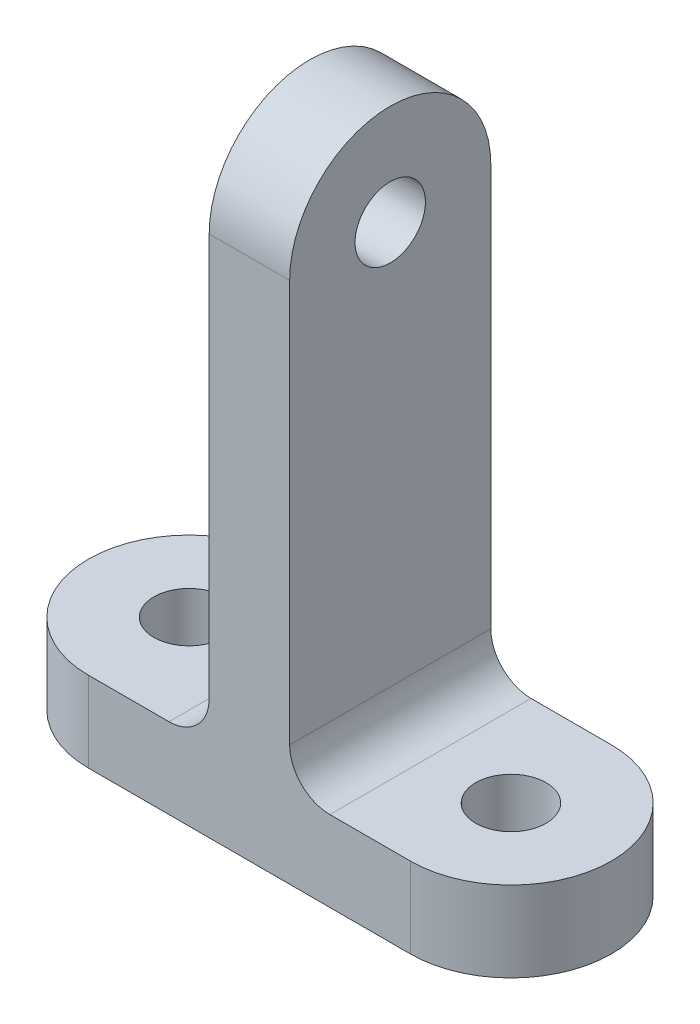
ISO-10303-21;
HEADER;
FILE_DESCRIPTION(('STEP AP214'),'2;1');
FILE_NAME('part.step','',(''),(''),'','','');
FILE_SCHEMA(('AUTOMOTIVE_DESIGN { 1 0 10303 214 1 1 1 1 }'));
ENDSEC;
DATA;
#1=APPLICATION_CONTEXT('core data for automotive mechanical design processes');
#2=APPLICATION_PROTOCOL_DEFINITION('international standard','automotive_design',2000,#1);
#3=PRODUCT_CONTEXT('',#1,'mechanical');
#4=PRODUCT('Part','Part','',(#3));
#5=PRODUCT_RELATED_PRODUCT_CATEGORY('part','',(#4));
#6=PRODUCT_DEFINITION_FORMATION('','',#4);
#7=PRODUCT_DEFINITION_CONTEXT('part definition',#1,'design');
#8=PRODUCT_DEFINITION('design','',#6,#7);
#9=PRODUCT_DEFINITION_SHAPE('','',#8);
#10=(LENGTH_UNIT() NAMED_UNIT(*) SI_UNIT(.MILLI.,.METRE.));
#11=(NAMED_UNIT(*) PLANE_ANGLE_UNIT() SI_UNIT($,.RADIAN.));
#12=(NAMED_UNIT(*) SI_UNIT($,.STERADIAN.) SOLID_ANGLE_UNIT());
#13=UNCERTAINTY_MEASURE_WITH_UNIT(LENGTH_MEASURE(1.E-05),#10,'distance_accuracy_value','');
#14=(GEOMETRIC_REPRESENTATION_CONTEXT(3) GLOBAL_UNCERTAINTY_ASSIGNED_CONTEXT((#13)) GLOBAL_UNIT_ASSIGNED_CONTEXT((#10,
#11,#12)) REPRESENTATION_CONTEXT('',''));
#15=CARTESIAN_POINT('',(0.,0.,0.));
#16=DIRECTION('',(0.,0.,1.));
#17=DIRECTION('',(1.,0.,0.));
#18=AXIS2_PLACEMENT_3D('',#15,#16,#17);
#19=CARTESIAN_POINT('',(-2.,31.,-5.));
#20=DIRECTION('',(1.,0.,0.));
#21=DIRECTION('',(0.,0.,-1.));
#22=AXIS2_PLACEMENT_3D('',#19,#20,#21);
#23=PLANE('',#22);
#24=CARTESIAN_POINT('',(-2.,26.,0.));
#25=DIRECTION('',(1.,0.,0.));
#26=DIRECTION('',(0.,0.,-1.));
#27=AXIS2_PLACEMENT_3D('',#24,#25,#26);
#28=CIRCLE('',#27,1.75);
#29=CARTESIAN_POINT('',(-2.,26.,-1.75));
#30=VERTEX_POINT('',#29);
#31=EDGE_CURVE('E153',#30,#30,#28,.F.);
#32=ORIENTED_EDGE('',*,*,#31,.F.);
#33=EDGE_LOOP('',(#32));
#34=FACE_BOUND('',#33,.T.);
#35=DIRECTION('',(0.,-1.,0.));
#36=VECTOR('',#35,1.);
#37=CARTESIAN_POINT('',(-2.,31.,-5.));
#38=LINE('',#37,#36);
#39=CARTESIAN_POINT('',(-2.,26.,-5.));
#40=VERTEX_POINT('',#39);
#41=CARTESIAN_POINT('',(-2.,6.,-5.));
#42=VERTEX_POINT('',#41);
#43=EDGE_CURVE('E152',#40,#42,#38,.T.);
#44=ORIENTED_EDGE('',*,*,#43,.T.);
#45=DIRECTION('',(0.,0.,1.));
#46=VECTOR('',#45,1.);
#47=CARTESIAN_POINT('',(-2.,6.,-5.));
#48=LINE('',#47,#46);
#49=CARTESIAN_POINT('',(-2.,6.,5.));
#50=VERTEX_POINT('',#49);
#51=EDGE_CURVE('E220',#42,#50,#48,.T.);
#52=ORIENTED_EDGE('',*,*,#51,.T.);
#53=DIRECTION('',(0.,-1.,0.));
#54=VECTOR('',#53,1.);
#55=CARTESIAN_POINT('',(-2.,31.,5.));
#56=LINE('',#55,#54);
#57=CARTESIAN_POINT('',(-2.,26.,5.));
#58=VERTEX_POINT('',#57);
#59=EDGE_CURVE('E161',#58,#50,#56,.T.);
#60=ORIENTED_EDGE('',*,*,#59,.F.);
#61=CARTESIAN_POINT('',(-2.,26.,0.));
#62=DIRECTION('',(1.,0.,0.));
#63=DIRECTION('',(0.,0.,-1.));
#64=AXIS2_PLACEMENT_3D('',#61,#62,#63);
#65=CIRCLE('',#64,5.);
#66=EDGE_CURVE('E163',#58,#40,#65,.F.);
#67=ORIENTED_EDGE('',*,*,#66,.T.);
#68=EDGE_LOOP('',(#44,#52,#60,#67));
#69=FACE_BOUND('',#68,.T.);
#70=ADVANCED_FACE('F59',(#34,#69),#23,.F.);
#71=CARTESIAN_POINT('',(2.,31.,-5.));
#72=DIRECTION('',(-1.,0.,0.));
#73=DIRECTION('',(0.,0.,1.));
#74=AXIS2_PLACEMENT_3D('',#71,#72,#73);
#75=PLANE('',#74);
#76=CARTESIAN_POINT('',(2.,26.,0.));
#77=DIRECTION('',(1.,0.,0.));
#78=DIRECTION('',(0.,0.,-1.));
#79=AXIS2_PLACEMENT_3D('',#76,#77,#78);
#80=CIRCLE('',#79,1.75);
#81=CARTESIAN_POINT('',(2.,26.,-1.75));
#82=VERTEX_POINT('',#81);
#83=EDGE_CURVE('E233',#82,#82,#80,.T.);
#84=ORIENTED_EDGE('',*,*,#83,.F.);
#85=EDGE_LOOP('',(#84));
#86=FACE_BOUND('',#85,.T.);
#87=DIRECTION('',(0.,-1.,0.));
#88=VECTOR('',#87,1.);
#89=CARTESIAN_POINT('',(2.,31.,5.));
#90=LINE('',#89,#88);
#91=CARTESIAN_POINT('',(2.,26.,5.));
#92=VERTEX_POINT('',#91);
#93=CARTESIAN_POINT('',(2.,6.,5.));
#94=VERTEX_POINT('',#93);
#95=EDGE_CURVE('E159',#92,#94,#90,.T.);
#96=ORIENTED_EDGE('',*,*,#95,.T.);
#97=DIRECTION('',(0.,0.,-1.));
#98=VECTOR('',#97,1.);
#99=CARTESIAN_POINT('',(2.,6.,-5.));
#100=LINE('',#99,#98);
#101=CARTESIAN_POINT('',(2.,6.,-5.));
#102=VERTEX_POINT('',#101);
#103=EDGE_CURVE('E158',#94,#102,#100,.T.);
#104=ORIENTED_EDGE('',*,*,#103,.T.);
#105=DIRECTION('',(0.,-1.,0.));
#106=VECTOR('',#105,1.);
#107=CARTESIAN_POINT('',(2.,31.,-5.));
#108=LINE('',#107,#106);
#109=CARTESIAN_POINT('',(2.,26.,-5.));
#110=VERTEX_POINT('',#109);
#111=EDGE_CURVE('E150',#110,#102,#108,.T.);
#112=ORIENTED_EDGE('',*,*,#111,.F.);
#113=CARTESIAN_POINT('',(2.,26.,0.));
#114=DIRECTION('',(1.,0.,0.));
#115=DIRECTION('',(0.,0.,-1.));
#116=AXIS2_PLACEMENT_3D('',#113,#114,#115);
#117=CIRCLE('',#116,5.);
#118=EDGE_CURVE('E135',#110,#92,#117,.T.);
#119=ORIENTED_EDGE('',*,*,#118,.T.);
#120=EDGE_LOOP('',(#96,#104,#112,#119));
#121=FACE_BOUND('',#120,.T.);
#122=ADVANCED_FACE('F156',(#86,#121),#75,.F.);
#123=CARTESIAN_POINT('',(0.,4.,-5.));
#124=DIRECTION('',(0.,0.,-1.));
#125=DIRECTION('',(-1.,0.,0.));
#126=AXIS2_PLACEMENT_3D('',#123,#124,#125);
#127=PLANE('',#126);
#128=ORIENTED_EDGE('',*,*,#43,.F.);
#129=DIRECTION('',(1.,0.,0.));
#130=VECTOR('',#129,1.);
#131=CARTESIAN_POINT('',(-9.07106781186547,26.,-5.));
#132=LINE('',#131,#130);
#133=EDGE_CURVE('E138',#40,#110,#132,.T.);
#134=ORIENTED_EDGE('',*,*,#133,.T.);
#135=ORIENTED_EDGE('',*,*,#111,.T.);
#136=CARTESIAN_POINT('',(4.,6.,-5.));
#137=DIRECTION('',(0.,0.,-1.));
#138=DIRECTION('',(-1.,0.,0.));
#139=AXIS2_PLACEMENT_3D('',#136,#137,#138);
#140=CIRCLE('',#139,2.);
#141=CARTESIAN_POINT('',(4.,4.,-5.));
#142=VERTEX_POINT('',#141);
#143=EDGE_CURVE('E216',#102,#142,#140,.F.);
#144=ORIENTED_EDGE('',*,*,#143,.T.);
#145=DIRECTION('',(1.,0.,0.));
#146=VECTOR('',#145,1.);
#147=CARTESIAN_POINT('',(0.,4.,-5.));
#148=LINE('',#147,#146);
#149=CARTESIAN_POINT('',(8.,4.,-5.));
#150=VERTEX_POINT('',#149);
#151=EDGE_CURVE('E183',#142,#150,#148,.T.);
#152=ORIENTED_EDGE('',*,*,#151,.T.);
#153=DIRECTION('',(0.,-1.,0.));
#154=VECTOR('',#153,1.);
#155=CARTESIAN_POINT('',(8.,4.,-5.));
#156=LINE('',#155,#154);
#157=CARTESIAN_POINT('',(8.,0.,-5.));
#158=VERTEX_POINT('',#157);
#159=EDGE_CURVE('E207',#150,#158,#156,.T.);
#160=ORIENTED_EDGE('',*,*,#159,.T.);
#161=DIRECTION('',(1.,0.,0.));
#162=VECTOR('',#161,1.);
#163=CARTESIAN_POINT('',(0.,0.,-5.));
#164=LINE('',#163,#162);
#165=CARTESIAN_POINT('',(-8.,0.,-5.));
#166=VERTEX_POINT('',#165);
#167=EDGE_CURVE('E201',#166,#158,#164,.T.);
#168=ORIENTED_EDGE('',*,*,#167,.F.);
#169=DIRECTION('',(0.,-1.,0.));
#170=VECTOR('',#169,1.);
#171=CARTESIAN_POINT('',(-8.,4.,-5.));
#172=LINE('',#171,#170);
#173=CARTESIAN_POINT('',(-8.,4.,-5.));
#174=VERTEX_POINT('',#173);
#175=EDGE_CURVE('E189',#174,#166,#172,.T.);
#176=ORIENTED_EDGE('',*,*,#175,.F.);
#177=CARTESIAN_POINT('',(-4.,4.,-5.));
#178=VERTEX_POINT('',#177);
#179=EDGE_CURVE('E184',#174,#178,#148,.T.);
#180=ORIENTED_EDGE('',*,*,#179,.T.);
#181=CARTESIAN_POINT('',(-4.,6.,-5.));
#182=DIRECTION('',(0.,0.,-1.));
#183=DIRECTION('',(-1.,0.,0.));
#184=AXIS2_PLACEMENT_3D('',#181,#182,#183);
#185=CIRCLE('',#184,2.);
#186=EDGE_CURVE('E12',#178,#42,#185,.F.);
#187=ORIENTED_EDGE('',*,*,#186,.T.);
#188=EDGE_LOOP('',(#128,#134,#135,#144,#152,#160,#168,#176,#180,#187));
#189=FACE_BOUND('',#188,.T.);
#190=ADVANCED_FACE('F149',(#189),#127,.T.);
#191=CARTESIAN_POINT('',(0.,4.,0.));
#192=DIRECTION('',(0.,1.,0.));
#193=DIRECTION('',(0.,0.,1.));
#194=AXIS2_PLACEMENT_3D('',#191,#192,#193);
#195=PLANE('',#194);
#196=DIRECTION('',(-1.,0.,0.));
#197=VECTOR('',#196,1.);
#198=CARTESIAN_POINT('',(0.,4.,5.));
#199=LINE('',#198,#197);
#200=CARTESIAN_POINT('',(-4.,4.,5.));
#201=VERTEX_POINT('',#200);
#202=CARTESIAN_POINT('',(-8.,4.,5.));
#203=VERTEX_POINT('',#202);
#204=EDGE_CURVE('E176',#201,#203,#199,.T.);
#205=ORIENTED_EDGE('',*,*,#204,.F.);
#206=DIRECTION('',(0.,0.,1.));
#207=VECTOR('',#206,1.);
#208=CARTESIAN_POINT('',(-4.,4.,0.));
#209=LINE('',#208,#207);
#210=EDGE_CURVE('E80',#201,#178,#209,.F.);
#211=ORIENTED_EDGE('',*,*,#210,.T.);
#212=ORIENTED_EDGE('',*,*,#179,.F.);
#213=CARTESIAN_POINT('',(-8.,4.,0.));
#214=DIRECTION('',(0.,1.,0.));
#215=DIRECTION('',(0.,0.,1.));
#216=AXIS2_PLACEMENT_3D('',#213,#214,#215);
#217=CIRCLE('',#216,5.);
#218=EDGE_CURVE('E172',#174,#203,#217,.T.);
#219=ORIENTED_EDGE('',*,*,#218,.T.);
#220=EDGE_LOOP('',(#205,#211,#212,#219));
#221=FACE_BOUND('',#220,.T.);
#222=CARTESIAN_POINT('',(-8.,4.,0.));
#223=DIRECTION('',(0.,1.,0.));
#224=DIRECTION('',(0.,0.,1.));
#225=AXIS2_PLACEMENT_3D('',#222,#223,#224);
#226=CIRCLE('',#225,1.75);
#227=CARTESIAN_POINT('',(-8.,4.,1.75));
#228=VERTEX_POINT('',#227);
#229=EDGE_CURVE('E169',#228,#228,#226,.T.);
#230=ORIENTED_EDGE('',*,*,#229,.F.);
#231=EDGE_LOOP('',(#230));
#232=FACE_BOUND('',#231,.T.);
#233=ADVANCED_FACE('F245',(#221,#232),#195,.T.);
#234=CARTESIAN_POINT('',(-8.,4.,0.));
#235=DIRECTION('',(0.,-1.,0.));
#236=DIRECTION('',(0.,0.,-1.));
#237=AXIS2_PLACEMENT_3D('',#234,#235,#236);
#238=CYLINDRICAL_SURFACE('',#237,5.);
#239=CARTESIAN_POINT('',(-8.,0.,0.));
#240=DIRECTION('',(0.,1.,0.));
#241=DIRECTION('',(0.,0.,1.));
#242=AXIS2_PLACEMENT_3D('',#239,#240,#241);
#243=CIRCLE('',#242,5.);
#244=CARTESIAN_POINT('',(-8.,0.,5.));
#245=VERTEX_POINT('',#244);
#246=EDGE_CURVE('E192',#166,#245,#243,.T.);
#247=ORIENTED_EDGE('',*,*,#246,.T.);
#248=DIRECTION('',(0.,-1.,0.));
#249=VECTOR('',#248,1.);
#250=CARTESIAN_POINT('',(-8.,4.,5.));
#251=LINE('',#250,#249);
#252=EDGE_CURVE('E211',#203,#245,#251,.T.);
#253=ORIENTED_EDGE('',*,*,#252,.F.);
#254=ORIENTED_EDGE('',*,*,#218,.F.);
#255=ORIENTED_EDGE('',*,*,#175,.T.);
#256=EDGE_LOOP('',(#247,#253,#254,#255));
#257=FACE_BOUND('',#256,.T.);
#258=ADVANCED_FACE('F271',(#257),#238,.T.);
#259=CARTESIAN_POINT('',(0.,4.,5.));
#260=DIRECTION('',(0.,0.,1.));
#261=DIRECTION('',(1.,0.,0.));
#262=AXIS2_PLACEMENT_3D('',#259,#260,#261);
#263=PLANE('',#262);
#264=DIRECTION('',(1.,0.,0.));
#265=VECTOR('',#264,1.);
#266=CARTESIAN_POINT('',(-9.07106781186547,26.,5.));
#267=LINE('',#266,#265);
#268=EDGE_CURVE('E141',#58,#92,#267,.T.);
#269=ORIENTED_EDGE('',*,*,#268,.F.);
#270=ORIENTED_EDGE('',*,*,#59,.T.);
#271=CARTESIAN_POINT('',(-4.,6.,5.));
#272=DIRECTION('',(0.,0.,1.));
#273=DIRECTION('',(1.,0.,0.));
#274=AXIS2_PLACEMENT_3D('',#271,#272,#273);
#275=CIRCLE('',#274,2.);
#276=EDGE_CURVE('E67',#50,#201,#275,.F.);
#277=ORIENTED_EDGE('',*,*,#276,.T.);
#278=ORIENTED_EDGE('',*,*,#204,.T.);
#279=ORIENTED_EDGE('',*,*,#252,.T.);
#280=DIRECTION('',(-1.,0.,0.));
#281=VECTOR('',#280,1.);
#282=CARTESIAN_POINT('',(0.,0.,5.));
#283=LINE('',#282,#281);
#284=CARTESIAN_POINT('',(8.,0.,5.));
#285=VERTEX_POINT('',#284);
#286=EDGE_CURVE('E195',#285,#245,#283,.T.);
#287=ORIENTED_EDGE('',*,*,#286,.F.);
#288=DIRECTION('',(0.,-1.,0.));
#289=VECTOR('',#288,1.);
#290=CARTESIAN_POINT('',(8.,4.,5.));
#291=LINE('',#290,#289);
#292=CARTESIAN_POINT('',(8.,4.,5.));
#293=VERTEX_POINT('',#292);
#294=EDGE_CURVE('E209',#293,#285,#291,.T.);
#295=ORIENTED_EDGE('',*,*,#294,.F.);
#296=CARTESIAN_POINT('',(4.,4.,5.));
#297=VERTEX_POINT('',#296);
#298=EDGE_CURVE('E177',#293,#297,#199,.T.);
#299=ORIENTED_EDGE('',*,*,#298,.T.);
#300=CARTESIAN_POINT('',(4.,6.,5.));
#301=DIRECTION('',(0.,0.,1.));
#302=DIRECTION('',(1.,0.,0.));
#303=AXIS2_PLACEMENT_3D('',#300,#301,#302);
#304=CIRCLE('',#303,2.);
#305=EDGE_CURVE('E218',#297,#94,#304,.F.);
#306=ORIENTED_EDGE('',*,*,#305,.T.);
#307=ORIENTED_EDGE('',*,*,#95,.F.);
#308=EDGE_LOOP('',(#269,#270,#277,#278,#279,#287,#295,#299,#306,#307));
#309=FACE_BOUND('',#308,.T.);
#310=ADVANCED_FACE('F228',(#309),#263,.T.);
#311=CARTESIAN_POINT('',(8.,4.,0.));
#312=DIRECTION('',(0.,-1.,0.));
#313=DIRECTION('',(0.,0.,-1.));
#314=AXIS2_PLACEMENT_3D('',#311,#312,#313);
#315=CYLINDRICAL_SURFACE('',#314,5.);
#316=CARTESIAN_POINT('',(8.,0.,0.));
#317=DIRECTION('',(0.,1.,0.));
#318=DIRECTION('',(0.,0.,1.));
#319=AXIS2_PLACEMENT_3D('',#316,#317,#318);
#320=CIRCLE('',#319,5.);
#321=EDGE_CURVE('E198',#285,#158,#320,.T.);
#322=ORIENTED_EDGE('',*,*,#321,.T.);
#323=ORIENTED_EDGE('',*,*,#159,.F.);
#324=CARTESIAN_POINT('',(8.,4.,0.));
#325=DIRECTION('',(0.,1.,0.));
#326=DIRECTION('',(0.,0.,1.));
#327=AXIS2_PLACEMENT_3D('',#324,#325,#326);
#328=CIRCLE('',#327,5.);
#329=EDGE_CURVE('E180',#293,#150,#328,.T.);
#330=ORIENTED_EDGE('',*,*,#329,.F.);
#331=ORIENTED_EDGE('',*,*,#294,.T.);
#332=EDGE_LOOP('',(#322,#323,#330,#331));
#333=FACE_BOUND('',#332,.T.);
#334=ADVANCED_FACE('F265',(#333),#315,.T.);
#335=CARTESIAN_POINT('',(-8.,4.,0.));
#336=DIRECTION('',(0.,-1.,0.));
#337=DIRECTION('',(0.,0.,-1.));
#338=AXIS2_PLACEMENT_3D('',#335,#336,#337);
#339=CYLINDRICAL_SURFACE('',#338,1.75);
#340=ORIENTED_EDGE('',*,*,#229,.T.);
#341=EDGE_LOOP('',(#340));
#342=FACE_BOUND('',#341,.T.);
#343=CARTESIAN_POINT('',(-8.,0.,0.));
#344=DIRECTION('',(0.,1.,0.));
#345=DIRECTION('',(0.,0.,1.));
#346=AXIS2_PLACEMENT_3D('',#343,#344,#345);
#347=CIRCLE('',#346,1.75);
#348=CARTESIAN_POINT('',(-8.,0.,1.75));
#349=VERTEX_POINT('',#348);
#350=EDGE_CURVE('E168',#349,#349,#347,.T.);
#351=ORIENTED_EDGE('',*,*,#350,.F.);
#352=EDGE_LOOP('',(#351));
#353=FACE_BOUND('',#352,.T.);
#354=ADVANCED_FACE('F262',(#342,#353),#339,.F.);
#355=CARTESIAN_POINT('',(8.,4.,0.));
#356=DIRECTION('',(0.,-1.,0.));
#357=DIRECTION('',(0.,0.,-1.));
#358=AXIS2_PLACEMENT_3D('',#355,#356,#357);
#359=CYLINDRICAL_SURFACE('',#358,1.75);
#360=CARTESIAN_POINT('',(8.,4.,0.));
#361=DIRECTION('',(0.,1.,0.));
#362=DIRECTION('',(0.,0.,1.));
#363=AXIS2_PLACEMENT_3D('',#360,#361,#362);
#364=CIRCLE('',#363,1.75);
#365=CARTESIAN_POINT('',(8.,4.,1.75));
#366=VERTEX_POINT('',#365);
#367=EDGE_CURVE('E186',#366,#366,#364,.T.);
#368=ORIENTED_EDGE('',*,*,#367,.T.);
#369=EDGE_LOOP('',(#368));
#370=FACE_BOUND('',#369,.T.);
#371=CARTESIAN_POINT('',(8.,0.,0.));
#372=DIRECTION('',(0.,1.,0.));
#373=DIRECTION('',(0.,0.,1.));
#374=AXIS2_PLACEMENT_3D('',#371,#372,#373);
#375=CIRCLE('',#374,1.75);
#376=CARTESIAN_POINT('',(8.,0.,1.75));
#377=VERTEX_POINT('',#376);
#378=EDGE_CURVE('E173',#377,#377,#375,.T.);
#379=ORIENTED_EDGE('',*,*,#378,.F.);
#380=EDGE_LOOP('',(#379));
#381=FACE_BOUND('',#380,.T.);
#382=ADVANCED_FACE('F256',(#370,#381),#359,.F.);
#383=ORIENTED_EDGE('',*,*,#151,.F.);
#384=DIRECTION('',(0.,0.,-1.));
#385=VECTOR('',#384,1.);
#386=CARTESIAN_POINT('',(4.,4.,0.));
#387=LINE('',#386,#385);
#388=EDGE_CURVE('E214',#142,#297,#387,.F.);
#389=ORIENTED_EDGE('',*,*,#388,.T.);
#390=ORIENTED_EDGE('',*,*,#298,.F.);
#391=ORIENTED_EDGE('',*,*,#329,.T.);
#392=EDGE_LOOP('',(#383,#389,#390,#391));
#393=FACE_BOUND('',#392,.T.);
#394=ORIENTED_EDGE('',*,*,#367,.F.);
#395=EDGE_LOOP('',(#394));
#396=FACE_BOUND('',#395,.T.);
#397=ADVANCED_FACE('F252',(#393,#396),#195,.T.);
#398=CARTESIAN_POINT('',(0.,0.,0.));
#399=DIRECTION('',(0.,1.,0.));
#400=DIRECTION('',(0.,0.,1.));
#401=AXIS2_PLACEMENT_3D('',#398,#399,#400);
#402=PLANE('',#401);
#403=ORIENTED_EDGE('',*,*,#350,.T.);
#404=EDGE_LOOP('',(#403));
#405=FACE_BOUND('',#404,.T.);
#406=ORIENTED_EDGE('',*,*,#246,.F.);
#407=ORIENTED_EDGE('',*,*,#167,.T.);
#408=ORIENTED_EDGE('',*,*,#321,.F.);
#409=ORIENTED_EDGE('',*,*,#286,.T.);
#410=EDGE_LOOP('',(#406,#407,#408,#409));
#411=FACE_BOUND('',#410,.T.);
#412=ORIENTED_EDGE('',*,*,#378,.T.);
#413=EDGE_LOOP('',(#412));
#414=FACE_BOUND('',#413,.T.);
#415=ADVANCED_FACE('F255',(#405,#411,#414),#402,.F.);
#416=CARTESIAN_POINT('',(-9.07106781186547,26.,0.));
#417=DIRECTION('',(1.,0.,0.));
#418=DIRECTION('',(0.,0.,-1.));
#419=AXIS2_PLACEMENT_3D('',#416,#417,#418);
#420=CYLINDRICAL_SURFACE('',#419,5.);
#421=ORIENTED_EDGE('',*,*,#268,.T.);
#422=ORIENTED_EDGE('',*,*,#118,.F.);
#423=ORIENTED_EDGE('',*,*,#133,.F.);
#424=ORIENTED_EDGE('',*,*,#66,.F.);
#425=EDGE_LOOP('',(#421,#422,#423,#424));
#426=FACE_BOUND('',#425,.T.);
#427=ADVANCED_FACE('F137',(#426),#420,.T.);
#428=CARTESIAN_POINT('',(-9.07106781186547,26.,0.));
#429=DIRECTION('',(1.,0.,0.));
#430=DIRECTION('',(0.,0.,-1.));
#431=AXIS2_PLACEMENT_3D('',#428,#429,#430);
#432=CYLINDRICAL_SURFACE('',#431,1.75);
#433=ORIENTED_EDGE('',*,*,#31,.T.);
#434=EDGE_LOOP('',(#433));
#435=FACE_BOUND('',#434,.T.);
#436=ORIENTED_EDGE('',*,*,#83,.T.);
#437=EDGE_LOOP('',(#436));
#438=FACE_BOUND('',#437,.T.);
#439=ADVANCED_FACE('F237',(#435,#438),#432,.F.);
#440=CARTESIAN_POINT('',(4.,6.,-5.));
#441=DIRECTION('',(0.,0.,-1.));
#442=DIRECTION('',(-1.,0.,0.));
#443=AXIS2_PLACEMENT_3D('',#440,#441,#442);
#444=CYLINDRICAL_SURFACE('',#443,2.);
#445=ORIENTED_EDGE('',*,*,#305,.F.);
#446=ORIENTED_EDGE('',*,*,#388,.F.);
#447=ORIENTED_EDGE('',*,*,#143,.F.);
#448=ORIENTED_EDGE('',*,*,#103,.F.);
#449=EDGE_LOOP('',(#445,#446,#447,#448));
#450=FACE_BOUND('',#449,.T.);
#451=ADVANCED_FACE('F277',(#450),#444,.F.);
#452=CARTESIAN_POINT('',(-4.,6.,-5.));
#453=DIRECTION('',(0.,0.,1.));
#454=DIRECTION('',(1.,0.,0.));
#455=AXIS2_PLACEMENT_3D('',#452,#453,#454);
#456=CYLINDRICAL_SURFACE('',#455,2.);
#457=ORIENTED_EDGE('',*,*,#186,.F.);
#458=ORIENTED_EDGE('',*,*,#210,.F.);
#459=ORIENTED_EDGE('',*,*,#276,.F.);
#460=ORIENTED_EDGE('',*,*,#51,.F.);
#461=EDGE_LOOP('',(#457,#458,#459,#460));
#462=FACE_BOUND('',#461,.T.);
#463=ADVANCED_FACE('F61',(#462),#456,.F.);
#464=CLOSED_SHELL('',(#70,#122,#190,#233,#258,#310,#334,#354,#382,#397,#415,#427,#439,#451,#463));
#465=MANIFOLD_SOLID_BREP('B2',#464);
#466=ADVANCED_BREP_SHAPE_REPRESENTATION('',(#18,#465),#14);
#467=SHAPE_DEFINITION_REPRESENTATION(#9,#466);
ENDSEC;
END-ISO-10303-21;
